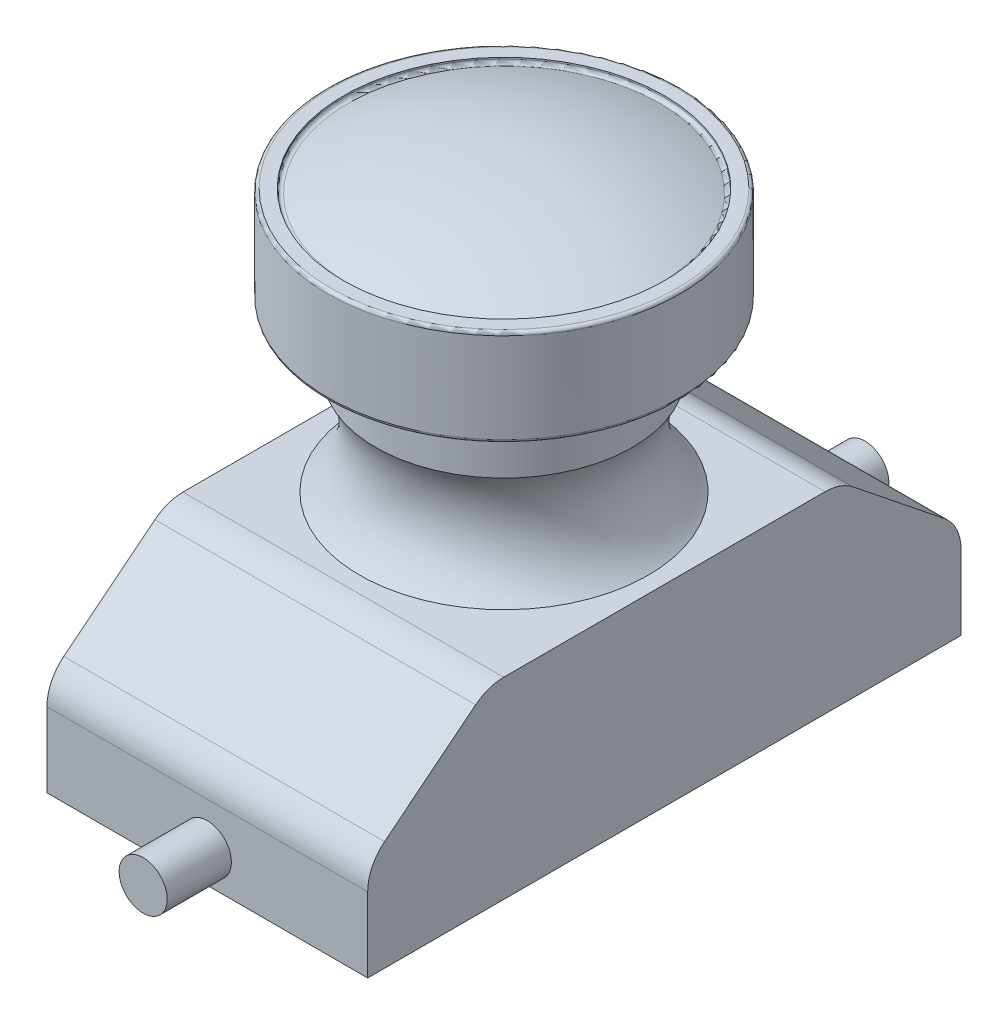
ISO-10303-21;
HEADER;
FILE_DESCRIPTION(('STEP AP214'),'2;1');
FILE_NAME('part.step','',(''),(''),'','','');
FILE_SCHEMA(('AUTOMOTIVE_DESIGN { 1 0 10303 214 1 1 1 1 }'));
ENDSEC;
DATA;
#1=APPLICATION_CONTEXT('core data for automotive mechanical design processes');
#2=APPLICATION_PROTOCOL_DEFINITION('international standard','automotive_design',2000,#1);
#3=PRODUCT_CONTEXT('',#1,'mechanical');
#4=PRODUCT('Part','Part','',(#3));
#5=PRODUCT_RELATED_PRODUCT_CATEGORY('part','',(#4));
#6=PRODUCT_DEFINITION_FORMATION('','',#4);
#7=PRODUCT_DEFINITION_CONTEXT('part definition',#1,'design');
#8=PRODUCT_DEFINITION('design','',#6,#7);
#9=PRODUCT_DEFINITION_SHAPE('','',#8);
#10=(LENGTH_UNIT() NAMED_UNIT(*) SI_UNIT(.MILLI.,.METRE.));
#11=(NAMED_UNIT(*) PLANE_ANGLE_UNIT() SI_UNIT($,.RADIAN.));
#12=(NAMED_UNIT(*) SI_UNIT($,.STERADIAN.) SOLID_ANGLE_UNIT());
#13=UNCERTAINTY_MEASURE_WITH_UNIT(LENGTH_MEASURE(1.E-05),#10,'distance_accuracy_value','');
#14=(GEOMETRIC_REPRESENTATION_CONTEXT(3) GLOBAL_UNCERTAINTY_ASSIGNED_CONTEXT((#13)) GLOBAL_UNIT_ASSIGNED_CONTEXT((#10,
#11,#12)) REPRESENTATION_CONTEXT('',''));
#15=CARTESIAN_POINT('',(0.,0.,0.));
#16=DIRECTION('',(0.,0.,1.));
#17=DIRECTION('',(1.,0.,0.));
#18=AXIS2_PLACEMENT_3D('',#15,#16,#17);
#19=CARTESIAN_POINT('',(5.,0.,9.25));
#20=DIRECTION('',(0.,0.,-1.));
#21=DIRECTION('',(-1.,0.,0.));
#22=AXIS2_PLACEMENT_3D('',#19,#20,#21);
#23=PLANE('',#22);
#24=CARTESIAN_POINT('',(0.,1.,9.25));
#25=DIRECTION('',(0.,0.,-1.));
#26=DIRECTION('',(-1.,0.,0.));
#27=AXIS2_PLACEMENT_3D('',#24,#25,#26);
#28=CIRCLE('',#27,0.75);
#29=CARTESIAN_POINT('',(-0.75,1.,9.25));
#30=VERTEX_POINT('',#29);
#31=EDGE_CURVE('E351',#30,#30,#28,.T.);
#32=ORIENTED_EDGE('',*,*,#31,.T.);
#33=EDGE_LOOP('',(#32));
#34=FACE_BOUND('',#33,.T.);
#35=DIRECTION('',(0.,-1.,0.));
#36=VECTOR('',#35,1.);
#37=CARTESIAN_POINT('',(5.,0.,9.25));
#38=LINE('',#37,#36);
#39=CARTESIAN_POINT('',(5.,2.3271252135188,9.25));
#40=VERTEX_POINT('',#39);
#41=CARTESIAN_POINT('',(5.,0.,9.25));
#42=VERTEX_POINT('',#41);
#43=EDGE_CURVE('E250',#40,#42,#38,.T.);
#44=ORIENTED_EDGE('',*,*,#43,.F.);
#45=DIRECTION('',(-1.,0.,0.));
#46=VECTOR('',#45,1.);
#47=CARTESIAN_POINT('',(5.,2.3271252135188,9.25));
#48=LINE('',#47,#46);
#49=CARTESIAN_POINT('',(-5.,2.3271252135188,9.25));
#50=VERTEX_POINT('',#49);
#51=EDGE_CURVE('E282',#40,#50,#48,.T.);
#52=ORIENTED_EDGE('',*,*,#51,.T.);
#53=DIRECTION('',(0.,-1.,0.));
#54=VECTOR('',#53,1.);
#55=CARTESIAN_POINT('',(-5.,0.,9.25));
#56=LINE('',#55,#54);
#57=CARTESIAN_POINT('',(-5.,0.,9.25));
#58=VERTEX_POINT('',#57);
#59=EDGE_CURVE('E315',#50,#58,#56,.T.);
#60=ORIENTED_EDGE('',*,*,#59,.T.);
#61=DIRECTION('',(-1.,0.,0.));
#62=VECTOR('',#61,1.);
#63=CARTESIAN_POINT('',(5.,0.,9.25));
#64=LINE('',#63,#62);
#65=EDGE_CURVE('E254',#42,#58,#64,.T.);
#66=ORIENTED_EDGE('',*,*,#65,.F.);
#67=EDGE_LOOP('',(#44,#52,#60,#66));
#68=FACE_BOUND('',#67,.T.);
#69=ADVANCED_FACE('F38',(#34,#68),#23,.F.);
#70=CARTESIAN_POINT('',(5.,0.,9.25));
#71=DIRECTION('',(0.,1.,0.));
#72=DIRECTION('',(0.,0.,1.));
#73=AXIS2_PLACEMENT_3D('',#70,#71,#72);
#74=PLANE('',#73);
#75=DIRECTION('',(0.,0.,-1.));
#76=VECTOR('',#75,1.);
#77=CARTESIAN_POINT('',(-5.,0.,9.25));
#78=LINE('',#77,#76);
#79=CARTESIAN_POINT('',(-5.,0.,-9.25));
#80=VERTEX_POINT('',#79);
#81=EDGE_CURVE('E243',#58,#80,#78,.T.);
#82=ORIENTED_EDGE('',*,*,#81,.T.);
#83=DIRECTION('',(-1.,0.,0.));
#84=VECTOR('',#83,1.);
#85=CARTESIAN_POINT('',(5.,0.,-9.25));
#86=LINE('',#85,#84);
#87=CARTESIAN_POINT('',(5.,0.,-9.25));
#88=VERTEX_POINT('',#87);
#89=EDGE_CURVE('E251',#88,#80,#86,.T.);
#90=ORIENTED_EDGE('',*,*,#89,.F.);
#91=DIRECTION('',(0.,0.,-1.));
#92=VECTOR('',#91,1.);
#93=CARTESIAN_POINT('',(5.,0.,9.25));
#94=LINE('',#93,#92);
#95=EDGE_CURVE('E218',#42,#88,#94,.T.);
#96=ORIENTED_EDGE('',*,*,#95,.F.);
#97=ORIENTED_EDGE('',*,*,#65,.T.);
#98=EDGE_LOOP('',(#82,#90,#96,#97));
#99=FACE_BOUND('',#98,.T.);
#100=ADVANCED_FACE('F138',(#99),#74,.F.);
#101=CARTESIAN_POINT('',(5.,3.,-9.25));
#102=DIRECTION('',(0.,0.,1.));
#103=DIRECTION('',(1.,0.,0.));
#104=AXIS2_PLACEMENT_3D('',#101,#102,#103);
#105=PLANE('',#104);
#106=CARTESIAN_POINT('',(0.,1.,-9.25));
#107=DIRECTION('',(0.,0.,1.));
#108=DIRECTION('',(1.,0.,0.));
#109=AXIS2_PLACEMENT_3D('',#106,#107,#108);
#110=CIRCLE('',#109,0.75);
#111=CARTESIAN_POINT('',(0.75,1.,-9.25));
#112=VERTEX_POINT('',#111);
#113=EDGE_CURVE('E11',#112,#112,#110,.F.);
#114=ORIENTED_EDGE('',*,*,#113,.F.);
#115=EDGE_LOOP('',(#114));
#116=FACE_BOUND('',#115,.T.);
#117=DIRECTION('',(0.,1.,0.));
#118=VECTOR('',#117,1.);
#119=CARTESIAN_POINT('',(-5.,3.,-9.25));
#120=LINE('',#119,#118);
#121=CARTESIAN_POINT('',(-5.,2.3271252135188,-9.25));
#122=VERTEX_POINT('',#121);
#123=EDGE_CURVE('E212',#80,#122,#120,.T.);
#124=ORIENTED_EDGE('',*,*,#123,.T.);
#125=DIRECTION('',(-1.,0.,0.));
#126=VECTOR('',#125,1.);
#127=CARTESIAN_POINT('',(5.,2.3271252135188,-9.25));
#128=LINE('',#127,#126);
#129=CARTESIAN_POINT('',(5.,2.3271252135188,-9.25));
#130=VERTEX_POINT('',#129);
#131=EDGE_CURVE('E47',#122,#130,#128,.F.);
#132=ORIENTED_EDGE('',*,*,#131,.T.);
#133=DIRECTION('',(0.,1.,0.));
#134=VECTOR('',#133,1.);
#135=CARTESIAN_POINT('',(5.,3.,-9.25));
#136=LINE('',#135,#134);
#137=EDGE_CURVE('E210',#88,#130,#136,.T.);
#138=ORIENTED_EDGE('',*,*,#137,.F.);
#139=ORIENTED_EDGE('',*,*,#89,.T.);
#140=EDGE_LOOP('',(#124,#132,#138,#139));
#141=FACE_BOUND('',#140,.T.);
#142=ADVANCED_FACE('F144',(#116,#141),#105,.F.);
#143=CARTESIAN_POINT('',(5.,6.,-5.5));
#144=DIRECTION('',(0.,-0.78086880944303,0.624695047554424));
#145=DIRECTION('',(0.,-0.624695047554424,-0.78086880944303));
#146=AXIS2_PLACEMENT_3D('',#143,#144,#145);
#147=PLANE('',#146);
#148=DIRECTION('',(0.,0.624695047554424,0.78086880944303));
#149=VECTOR('',#148,1.);
#150=CARTESIAN_POINT('',(-5.,6.,-5.5));
#151=LINE('',#150,#149);
#152=CARTESIAN_POINT('',(-5.,3.42034154673905,-8.72457306657619));
#153=VERTEX_POINT('',#152);
#154=CARTESIAN_POINT('',(-5.,5.69321633322024,-5.8834795834747));
#155=VERTEX_POINT('',#154);
#156=EDGE_CURVE('E229',#153,#155,#151,.T.);
#157=ORIENTED_EDGE('',*,*,#156,.T.);
#158=DIRECTION('',(-1.,0.,0.));
#159=VECTOR('',#158,1.);
#160=CARTESIAN_POINT('',(5.,5.69321633322024,-5.8834795834747));
#161=LINE('',#160,#159);
#162=CARTESIAN_POINT('',(5.,5.69321633322024,-5.8834795834747));
#163=VERTEX_POINT('',#162);
#164=EDGE_CURVE('E175',#155,#163,#161,.F.);
#165=ORIENTED_EDGE('',*,*,#164,.T.);
#166=DIRECTION('',(0.,0.624695047554424,0.78086880944303));
#167=VECTOR('',#166,1.);
#168=CARTESIAN_POINT('',(5.,6.,-5.5));
#169=LINE('',#168,#167);
#170=CARTESIAN_POINT('',(5.,3.42034154673905,-8.72457306657619));
#171=VERTEX_POINT('',#170);
#172=EDGE_CURVE('E221',#171,#163,#169,.T.);
#173=ORIENTED_EDGE('',*,*,#172,.F.);
#174=DIRECTION('',(-1.,0.,0.));
#175=VECTOR('',#174,1.);
#176=CARTESIAN_POINT('',(5.,3.42034154673905,-8.72457306657619));
#177=LINE('',#176,#175);
#178=EDGE_CURVE('E197',#171,#153,#177,.T.);
#179=ORIENTED_EDGE('',*,*,#178,.T.);
#180=EDGE_LOOP('',(#157,#165,#173,#179));
#181=FACE_BOUND('',#180,.T.);
#182=ADVANCED_FACE('F228',(#181),#147,.F.);
#183=CARTESIAN_POINT('',(5.,6.,5.5));
#184=DIRECTION('',(0.,-1.,0.));
#185=DIRECTION('',(0.,0.,-1.));
#186=AXIS2_PLACEMENT_3D('',#183,#184,#185);
#187=PLANE('',#186);
#188=CARTESIAN_POINT('',(0.,6.,0.));
#189=DIRECTION('',(0.,-1.,0.));
#190=DIRECTION('',(0.,0.,-1.));
#191=AXIS2_PLACEMENT_3D('',#188,#189,#190);
#192=CIRCLE('',#191,4.5);
#193=CARTESIAN_POINT('',(0.,6.,-4.5));
#194=VERTEX_POINT('',#193);
#195=EDGE_CURVE('E318',#194,#194,#192,.T.);
#196=ORIENTED_EDGE('',*,*,#195,.T.);
#197=EDGE_LOOP('',(#196));
#198=FACE_BOUND('',#197,.T.);
#199=DIRECTION('',(0.,0.,1.));
#200=VECTOR('',#199,1.);
#201=CARTESIAN_POINT('',(-5.,6.,5.5));
#202=LINE('',#201,#200);
#203=CARTESIAN_POINT('',(-5.,6.,-5.0089065168985));
#204=VERTEX_POINT('',#203);
#205=CARTESIAN_POINT('',(-5.,6.,5.0089065168985));
#206=VERTEX_POINT('',#205);
#207=EDGE_CURVE('E236',#204,#206,#202,.T.);
#208=ORIENTED_EDGE('',*,*,#207,.T.);
#209=DIRECTION('',(-1.,0.,0.));
#210=VECTOR('',#209,1.);
#211=CARTESIAN_POINT('',(5.,6.,5.0089065168985));
#212=LINE('',#211,#210);
#213=CARTESIAN_POINT('',(5.,6.,5.0089065168985));
#214=VERTEX_POINT('',#213);
#215=EDGE_CURVE('E54',#206,#214,#212,.F.);
#216=ORIENTED_EDGE('',*,*,#215,.T.);
#217=DIRECTION('',(0.,0.,1.));
#218=VECTOR('',#217,1.);
#219=CARTESIAN_POINT('',(5.,6.,5.5));
#220=LINE('',#219,#218);
#221=CARTESIAN_POINT('',(5.,6.,-5.0089065168985));
#222=VERTEX_POINT('',#221);
#223=EDGE_CURVE('E311',#222,#214,#220,.T.);
#224=ORIENTED_EDGE('',*,*,#223,.F.);
#225=DIRECTION('',(-1.,0.,0.));
#226=VECTOR('',#225,1.);
#227=CARTESIAN_POINT('',(5.,6.,-5.0089065168985));
#228=LINE('',#227,#226);
#229=EDGE_CURVE('E177',#222,#204,#228,.T.);
#230=ORIENTED_EDGE('',*,*,#229,.T.);
#231=EDGE_LOOP('',(#208,#216,#224,#230));
#232=FACE_BOUND('',#231,.T.);
#233=ADVANCED_FACE('F385',(#198,#232),#187,.F.);
#234=CARTESIAN_POINT('',(5.,3.,9.25));
#235=DIRECTION('',(0.,-0.78086880944303,-0.624695047554424));
#236=DIRECTION('',(0.,0.624695047554424,-0.78086880944303));
#237=AXIS2_PLACEMENT_3D('',#234,#235,#236);
#238=PLANE('',#237);
#239=DIRECTION('',(0.,-0.624695047554424,0.78086880944303));
#240=VECTOR('',#239,1.);
#241=CARTESIAN_POINT('',(-5.,3.,9.25));
#242=LINE('',#241,#240);
#243=CARTESIAN_POINT('',(-5.,5.69321633322024,5.8834795834747));
#244=VERTEX_POINT('',#243);
#245=CARTESIAN_POINT('',(-5.,3.42034154673905,8.72457306657619));
#246=VERTEX_POINT('',#245);
#247=EDGE_CURVE('E241',#244,#246,#242,.T.);
#248=ORIENTED_EDGE('',*,*,#247,.T.);
#249=DIRECTION('',(-1.,0.,0.));
#250=VECTOR('',#249,1.);
#251=CARTESIAN_POINT('',(5.,3.42034154673905,8.72457306657619));
#252=LINE('',#251,#250);
#253=CARTESIAN_POINT('',(5.,3.42034154673905,8.72457306657619));
#254=VERTEX_POINT('',#253);
#255=EDGE_CURVE('E187',#246,#254,#252,.F.);
#256=ORIENTED_EDGE('',*,*,#255,.T.);
#257=DIRECTION('',(0.,-0.624695047554424,0.78086880944303));
#258=VECTOR('',#257,1.);
#259=CARTESIAN_POINT('',(5.,3.,9.25));
#260=LINE('',#259,#258);
#261=CARTESIAN_POINT('',(5.,5.69321633322024,5.8834795834747));
#262=VERTEX_POINT('',#261);
#263=EDGE_CURVE('E255',#262,#254,#260,.T.);
#264=ORIENTED_EDGE('',*,*,#263,.F.);
#265=DIRECTION('',(-1.,0.,0.));
#266=VECTOR('',#265,1.);
#267=CARTESIAN_POINT('',(5.,5.69321633322024,5.8834795834747));
#268=LINE('',#267,#266);
#269=EDGE_CURVE('E296',#262,#244,#268,.T.);
#270=ORIENTED_EDGE('',*,*,#269,.T.);
#271=EDGE_LOOP('',(#248,#256,#264,#270));
#272=FACE_BOUND('',#271,.T.);
#273=ADVANCED_FACE('F304',(#272),#238,.F.);
#274=CARTESIAN_POINT('',(5.,0.,0.));
#275=DIRECTION('',(-1.,0.,0.));
#276=DIRECTION('',(0.,0.,1.));
#277=AXIS2_PLACEMENT_3D('',#274,#275,#276);
#278=PLANE('',#277);
#279=ORIENTED_EDGE('',*,*,#263,.T.);
#280=CARTESIAN_POINT('',(5.,2.3271252135188,7.85));
#281=DIRECTION('',(-1.,0.,0.));
#282=DIRECTION('',(0.,0.,1.));
#283=AXIS2_PLACEMENT_3D('',#280,#281,#282);
#284=CIRCLE('',#283,1.4);
#285=EDGE_CURVE('E185',#254,#40,#284,.F.);
#286=ORIENTED_EDGE('',*,*,#285,.T.);
#287=ORIENTED_EDGE('',*,*,#43,.T.);
#288=ORIENTED_EDGE('',*,*,#95,.T.);
#289=ORIENTED_EDGE('',*,*,#137,.T.);
#290=CARTESIAN_POINT('',(5.,2.3271252135188,-7.85));
#291=DIRECTION('',(-1.,0.,0.));
#292=DIRECTION('',(0.,0.,1.));
#293=AXIS2_PLACEMENT_3D('',#290,#291,#292);
#294=CIRCLE('',#293,1.4);
#295=EDGE_CURVE('E180',#130,#171,#294,.F.);
#296=ORIENTED_EDGE('',*,*,#295,.T.);
#297=ORIENTED_EDGE('',*,*,#172,.T.);
#298=CARTESIAN_POINT('',(5.,4.6,-5.0089065168985));
#299=DIRECTION('',(-1.,0.,0.));
#300=DIRECTION('',(0.,0.,1.));
#301=AXIS2_PLACEMENT_3D('',#298,#299,#300);
#302=CIRCLE('',#301,1.4);
#303=EDGE_CURVE('E61',#163,#222,#302,.F.);
#304=ORIENTED_EDGE('',*,*,#303,.T.);
#305=ORIENTED_EDGE('',*,*,#223,.T.);
#306=CARTESIAN_POINT('',(5.,4.6,5.0089065168985));
#307=DIRECTION('',(-1.,0.,0.));
#308=DIRECTION('',(0.,0.,1.));
#309=AXIS2_PLACEMENT_3D('',#306,#307,#308);
#310=CIRCLE('',#309,1.4);
#311=EDGE_CURVE('E179',#214,#262,#310,.F.);
#312=ORIENTED_EDGE('',*,*,#311,.T.);
#313=EDGE_LOOP('',(#279,#286,#287,#288,#289,#296,#297,#304,#305,#312));
#314=FACE_BOUND('',#313,.T.);
#315=ADVANCED_FACE('F215',(#314),#278,.F.);
#316=CARTESIAN_POINT('',(-5.,0.,0.));
#317=DIRECTION('',(-1.,0.,0.));
#318=DIRECTION('',(0.,0.,1.));
#319=AXIS2_PLACEMENT_3D('',#316,#317,#318);
#320=PLANE('',#319);
#321=ORIENTED_EDGE('',*,*,#59,.F.);
#322=CARTESIAN_POINT('',(-5.,2.3271252135188,7.85));
#323=DIRECTION('',(-1.,0.,0.));
#324=DIRECTION('',(0.,0.,1.));
#325=AXIS2_PLACEMENT_3D('',#322,#323,#324);
#326=CIRCLE('',#325,1.4);
#327=EDGE_CURVE('E293',#50,#246,#326,.T.);
#328=ORIENTED_EDGE('',*,*,#327,.T.);
#329=ORIENTED_EDGE('',*,*,#247,.F.);
#330=CARTESIAN_POINT('',(-5.,4.6,5.0089065168985));
#331=DIRECTION('',(-1.,0.,0.));
#332=DIRECTION('',(0.,0.,1.));
#333=AXIS2_PLACEMENT_3D('',#330,#331,#332);
#334=CIRCLE('',#333,1.4);
#335=EDGE_CURVE('E290',#244,#206,#334,.T.);
#336=ORIENTED_EDGE('',*,*,#335,.T.);
#337=ORIENTED_EDGE('',*,*,#207,.F.);
#338=CARTESIAN_POINT('',(-5.,4.6,-5.0089065168985));
#339=DIRECTION('',(-1.,0.,0.));
#340=DIRECTION('',(0.,0.,1.));
#341=AXIS2_PLACEMENT_3D('',#338,#339,#340);
#342=CIRCLE('',#341,1.4);
#343=EDGE_CURVE('E234',#204,#155,#342,.T.);
#344=ORIENTED_EDGE('',*,*,#343,.T.);
#345=ORIENTED_EDGE('',*,*,#156,.F.);
#346=CARTESIAN_POINT('',(-5.,2.3271252135188,-7.85));
#347=DIRECTION('',(-1.,0.,0.));
#348=DIRECTION('',(0.,0.,1.));
#349=AXIS2_PLACEMENT_3D('',#346,#347,#348);
#350=CIRCLE('',#349,1.4);
#351=EDGE_CURVE('E224',#153,#122,#350,.T.);
#352=ORIENTED_EDGE('',*,*,#351,.T.);
#353=ORIENTED_EDGE('',*,*,#123,.F.);
#354=ORIENTED_EDGE('',*,*,#81,.F.);
#355=EDGE_LOOP('',(#321,#328,#329,#336,#337,#344,#345,#352,#353,#354));
#356=FACE_BOUND('',#355,.T.);
#357=ADVANCED_FACE('F232',(#356),#320,.T.);
#358=CARTESIAN_POINT('',(0.,7.89402615915736,0.));
#359=DIRECTION('',(0.,-1.,0.));
#360=DIRECTION('',(0.,0.,-1.));
#361=AXIS2_PLACEMENT_3D('',#358,#359,#360);
#362=TOROIDAL_SURFACE('',#361,6.13176741860708,2.5);
#363=CARTESIAN_POINT('',(0.,9.20000000000001,0.));
#364=DIRECTION('',(0.,-1.,0.));
#365=DIRECTION('',(0.,0.,-1.));
#366=AXIS2_PLACEMENT_3D('',#363,#364,#365);
#367=CIRCLE('',#366,4.);
#368=CARTESIAN_POINT('',(0.,9.20000000000001,-4.));
#369=VERTEX_POINT('',#368);
#370=EDGE_CURVE('E324',#369,#369,#367,.T.);
#371=ORIENTED_EDGE('',*,*,#370,.T.);
#372=EDGE_LOOP('',(#371));
#373=FACE_BOUND('',#372,.T.);
#374=ORIENTED_EDGE('',*,*,#195,.F.);
#375=EDGE_LOOP('',(#374));
#376=FACE_BOUND('',#375,.T.);
#377=ADVANCED_FACE('F395',(#373,#376),#362,.F.);
#378=CARTESIAN_POINT('',(0.,6.,0.));
#379=DIRECTION('',(0.,-1.,0.));
#380=DIRECTION('',(0.,0.,-1.));
#381=AXIS2_PLACEMENT_3D('',#378,#379,#380);
#382=CYLINDRICAL_SURFACE('',#381,4.);
#383=CARTESIAN_POINT('',(0.,11.2,0.));
#384=DIRECTION('',(0.,-1.,0.));
#385=DIRECTION('',(0.,0.,-1.));
#386=AXIS2_PLACEMENT_3D('',#383,#384,#385);
#387=CIRCLE('',#386,4.);
#388=CARTESIAN_POINT('',(0.,11.2,-4.));
#389=VERTEX_POINT('',#388);
#390=EDGE_CURVE('E338',#389,#389,#387,.T.);
#391=ORIENTED_EDGE('',*,*,#390,.T.);
#392=EDGE_LOOP('',(#391));
#393=FACE_BOUND('',#392,.T.);
#394=ORIENTED_EDGE('',*,*,#370,.F.);
#395=EDGE_LOOP('',(#394));
#396=FACE_BOUND('',#395,.T.);
#397=ADVANCED_FACE('F400',(#393,#396),#382,.T.);
#398=CARTESIAN_POINT('',(0.,11.2,-5.5));
#399=DIRECTION('',(0.,-1.,0.));
#400=DIRECTION('',(0.,0.,-1.));
#401=AXIS2_PLACEMENT_3D('',#398,#399,#400);
#402=PLANE('',#401);
#403=CARTESIAN_POINT('',(0.,11.2,0.));
#404=DIRECTION('',(0.,-1.,0.));
#405=DIRECTION('',(0.,0.,-1.));
#406=AXIS2_PLACEMENT_3D('',#403,#404,#405);
#407=CIRCLE('',#406,5.4);
#408=CARTESIAN_POINT('',(0.,11.2,-5.4));
#409=VERTEX_POINT('',#408);
#410=EDGE_CURVE('E259',#409,#409,#407,.T.);
#411=ORIENTED_EDGE('',*,*,#410,.T.);
#412=EDGE_LOOP('',(#411));
#413=FACE_BOUND('',#412,.T.);
#414=ORIENTED_EDGE('',*,*,#390,.F.);
#415=EDGE_LOOP('',(#414));
#416=FACE_BOUND('',#415,.T.);
#417=ADVANCED_FACE('F404',(#413,#416),#402,.T.);
#418=CARTESIAN_POINT('',(0.,6.,0.));
#419=DIRECTION('',(0.,-1.,0.));
#420=DIRECTION('',(0.,0.,-1.));
#421=AXIS2_PLACEMENT_3D('',#418,#419,#420);
#422=CYLINDRICAL_SURFACE('',#421,5.5);
#423=CARTESIAN_POINT('',(0.,11.3,0.));
#424=DIRECTION('',(0.,-1.,0.));
#425=DIRECTION('',(0.,0.,-1.));
#426=AXIS2_PLACEMENT_3D('',#423,#424,#425);
#427=CIRCLE('',#426,5.5);
#428=CARTESIAN_POINT('',(0.,11.3,-5.5));
#429=VERTEX_POINT('',#428);
#430=EDGE_CURVE('E267',#429,#429,#427,.F.);
#431=ORIENTED_EDGE('',*,*,#430,.T.);
#432=EDGE_LOOP('',(#431));
#433=FACE_BOUND('',#432,.T.);
#434=CARTESIAN_POINT('',(0.,14.1,0.));
#435=DIRECTION('',(0.,1.,0.));
#436=DIRECTION('',(0.,0.,1.));
#437=AXIS2_PLACEMENT_3D('',#434,#435,#436);
#438=CIRCLE('',#437,5.5);
#439=CARTESIAN_POINT('',(0.,14.1,5.5));
#440=VERTEX_POINT('',#439);
#441=EDGE_CURVE('E263',#440,#440,#438,.F.);
#442=ORIENTED_EDGE('',*,*,#441,.T.);
#443=EDGE_LOOP('',(#442));
#444=FACE_BOUND('',#443,.T.);
#445=ADVANCED_FACE('F408',(#433,#444),#422,.T.);
#446=CARTESIAN_POINT('',(0.,14.2,-5.));
#447=DIRECTION('',(0.,1.,0.));
#448=DIRECTION('',(0.,0.,1.));
#449=AXIS2_PLACEMENT_3D('',#446,#447,#448);
#450=PLANE('',#449);
#451=CARTESIAN_POINT('',(0.,14.2,0.));
#452=DIRECTION('',(0.,1.,0.));
#453=DIRECTION('',(0.,0.,1.));
#454=AXIS2_PLACEMENT_3D('',#451,#452,#453);
#455=CIRCLE('',#454,5.4);
#456=CARTESIAN_POINT('',(0.,14.2,5.4));
#457=VERTEX_POINT('',#456);
#458=EDGE_CURVE('E271',#457,#457,#455,.T.);
#459=ORIENTED_EDGE('',*,*,#458,.T.);
#460=EDGE_LOOP('',(#459));
#461=FACE_BOUND('',#460,.T.);
#462=CARTESIAN_POINT('',(0.,14.2,0.));
#463=DIRECTION('',(0.,-1.,0.));
#464=DIRECTION('',(0.,0.,-1.));
#465=AXIS2_PLACEMENT_3D('',#462,#463,#464);
#466=CIRCLE('',#465,5.);
#467=CARTESIAN_POINT('',(0.,14.2,-5.));
#468=VERTEX_POINT('',#467);
#469=EDGE_CURVE('E342',#468,#468,#466,.T.);
#470=ORIENTED_EDGE('',*,*,#469,.T.);
#471=EDGE_LOOP('',(#470));
#472=FACE_BOUND('',#471,.T.);
#473=ADVANCED_FACE('F132',(#461,#472),#450,.T.);
#474=CARTESIAN_POINT('',(0.,6.,0.));
#475=DIRECTION('',(0.,-1.,0.));
#476=DIRECTION('',(0.,0.,-1.));
#477=AXIS2_PLACEMENT_3D('',#474,#475,#476);
#478=CYLINDRICAL_SURFACE('',#477,5.);
#479=CARTESIAN_POINT('',(0.,14.151701238125,0.));
#480=DIRECTION('',(0.,-1.,0.));
#481=DIRECTION('',(0.,0.,-1.));
#482=AXIS2_PLACEMENT_3D('',#479,#480,#481);
#483=CIRCLE('',#482,5.);
#484=CARTESIAN_POINT('',(0.,14.151701238125,-5.));
#485=VERTEX_POINT('',#484);
#486=EDGE_CURVE('E275',#485,#485,#483,.T.);
#487=ORIENTED_EDGE('',*,*,#486,.T.);
#488=EDGE_LOOP('',(#487));
#489=FACE_BOUND('',#488,.T.);
#490=ORIENTED_EDGE('',*,*,#469,.F.);
#491=EDGE_LOOP('',(#490));
#492=FACE_BOUND('',#491,.T.);
#493=ADVANCED_FACE('F122',(#489,#492),#478,.F.);
#494=CARTESIAN_POINT('',(0.,3.00167236240251,-0.200334472480498));
#495=DIRECTION('',(-1.,0.,0.));
#496=DIRECTION('',(0.,0.,-1.));
#497=AXIS2_PLACEMENT_3D('',#494,#495,#496);
#498=CIRCLE('',#497,12.);
#499=TRIMMED_CURVE('',#498,(PARAMETER_VALUE(-1.58749164174817)),
(PARAMETER_VALUE(1.58749164174817)),.T.,.PARAMETER.);
#500=CARTESIAN_POINT('',(0.,3.00167236240251,0.));
#501=DIRECTION('',(0.,-1.,0.));
#502=AXIS1_PLACEMENT('',#500,#501);
#503=SURFACE_OF_REVOLUTION('',#499,#502);
#504=CARTESIAN_POINT('',(0.,14.0595522391521,0.));
#505=DIRECTION('',(0.,-1.,0.));
#506=DIRECTION('',(0.,0.,-1.));
#507=AXIS2_PLACEMENT_3D('',#504,#505,#506);
#508=CIRCLE('',#507,4.86115978902877);
#509=CARTESIAN_POINT('',(0.,14.0595522391521,-4.86115978902877));
#510=VERTEX_POINT('',#509);
#511=EDGE_CURVE('E279',#510,#510,#508,.F.);
#512=ORIENTED_EDGE('',*,*,#511,.T.);
#513=EDGE_LOOP('',(#512));
#514=FACE_BOUND('',#513,.T.);
#515=CARTESIAN_POINT('',(0.,15.,0.));
#516=VERTEX_POINT('',#515);
#517=VERTEX_LOOP('',#516);
#518=FACE_BOUND('',#517,.T.);
#519=ADVANCED_FACE('F119',(#514,#518),#503,.T.);
#520=CARTESIAN_POINT('',(0.,11.3,0.));
#521=DIRECTION('',(0.,-1.,0.));
#522=DIRECTION('',(0.,0.,-1.));
#523=AXIS2_PLACEMENT_3D('',#520,#521,#522);
#524=TOROIDAL_SURFACE('',#523,5.4,0.1);
#525=ORIENTED_EDGE('',*,*,#430,.F.);
#526=EDGE_LOOP('',(#525));
#527=FACE_BOUND('',#526,.T.);
#528=ORIENTED_EDGE('',*,*,#410,.F.);
#529=EDGE_LOOP('',(#528));
#530=FACE_BOUND('',#529,.T.);
#531=ADVANCED_FACE('F121',(#527,#530),#524,.T.);
#532=CARTESIAN_POINT('',(0.,14.1,0.));
#533=DIRECTION('',(0.,1.,0.));
#534=DIRECTION('',(0.,0.,1.));
#535=AXIS2_PLACEMENT_3D('',#532,#533,#534);
#536=TOROIDAL_SURFACE('',#535,5.4,0.1);
#537=ORIENTED_EDGE('',*,*,#458,.F.);
#538=EDGE_LOOP('',(#537));
#539=FACE_BOUND('',#538,.T.);
#540=ORIENTED_EDGE('',*,*,#441,.F.);
#541=EDGE_LOOP('',(#540));
#542=FACE_BOUND('',#541,.T.);
#543=ADVANCED_FACE('F129',(#539,#542),#536,.T.);
#544=CARTESIAN_POINT('',(0.,14.151701238125,0.));
#545=DIRECTION('',(0.,-1.,0.));
#546=DIRECTION('',(0.,0.,-1.));
#547=AXIS2_PLACEMENT_3D('',#544,#545,#546);
#548=TOROIDAL_SURFACE('',#547,4.9,0.1);
#549=ORIENTED_EDGE('',*,*,#511,.F.);
#550=EDGE_LOOP('',(#549));
#551=FACE_BOUND('',#550,.T.);
#552=ORIENTED_EDGE('',*,*,#486,.F.);
#553=EDGE_LOOP('',(#552));
#554=FACE_BOUND('',#553,.T.);
#555=ADVANCED_FACE('F153',(#551,#554),#548,.F.);
#556=CARTESIAN_POINT('',(5.,2.3271252135188,7.85));
#557=DIRECTION('',(-1.,0.,0.));
#558=DIRECTION('',(0.,0.,1.));
#559=AXIS2_PLACEMENT_3D('',#556,#557,#558);
#560=CYLINDRICAL_SURFACE('',#559,1.4);
#561=ORIENTED_EDGE('',*,*,#285,.F.);
#562=ORIENTED_EDGE('',*,*,#255,.F.);
#563=ORIENTED_EDGE('',*,*,#327,.F.);
#564=ORIENTED_EDGE('',*,*,#51,.F.);
#565=EDGE_LOOP('',(#561,#562,#563,#564));
#566=FACE_BOUND('',#565,.T.);
#567=ADVANCED_FACE('F157',(#566),#560,.T.);
#568=CARTESIAN_POINT('',(5.,4.6,5.0089065168985));
#569=DIRECTION('',(-1.,0.,0.));
#570=DIRECTION('',(0.,0.,1.));
#571=AXIS2_PLACEMENT_3D('',#568,#569,#570);
#572=CYLINDRICAL_SURFACE('',#571,1.4);
#573=ORIENTED_EDGE('',*,*,#311,.F.);
#574=ORIENTED_EDGE('',*,*,#215,.F.);
#575=ORIENTED_EDGE('',*,*,#335,.F.);
#576=ORIENTED_EDGE('',*,*,#269,.F.);
#577=EDGE_LOOP('',(#573,#574,#575,#576));
#578=FACE_BOUND('',#577,.T.);
#579=ADVANCED_FACE('F161',(#578),#572,.T.);
#580=CARTESIAN_POINT('',(5.,4.6,-5.0089065168985));
#581=DIRECTION('',(-1.,0.,0.));
#582=DIRECTION('',(0.,0.,1.));
#583=AXIS2_PLACEMENT_3D('',#580,#581,#582);
#584=CYLINDRICAL_SURFACE('',#583,1.4);
#585=ORIENTED_EDGE('',*,*,#303,.F.);
#586=ORIENTED_EDGE('',*,*,#164,.F.);
#587=ORIENTED_EDGE('',*,*,#343,.F.);
#588=ORIENTED_EDGE('',*,*,#229,.F.);
#589=EDGE_LOOP('',(#585,#586,#587,#588));
#590=FACE_BOUND('',#589,.T.);
#591=ADVANCED_FACE('F164',(#590),#584,.T.);
#592=CARTESIAN_POINT('',(5.,2.3271252135188,-7.85));
#593=DIRECTION('',(-1.,0.,0.));
#594=DIRECTION('',(0.,0.,1.));
#595=AXIS2_PLACEMENT_3D('',#592,#593,#594);
#596=CYLINDRICAL_SURFACE('',#595,1.4);
#597=ORIENTED_EDGE('',*,*,#295,.F.);
#598=ORIENTED_EDGE('',*,*,#131,.F.);
#599=ORIENTED_EDGE('',*,*,#351,.F.);
#600=ORIENTED_EDGE('',*,*,#178,.F.);
#601=EDGE_LOOP('',(#597,#598,#599,#600));
#602=FACE_BOUND('',#601,.T.);
#603=ADVANCED_FACE('F40',(#602),#596,.T.);
#604=CARTESIAN_POINT('',(0.,1.,-11.25));
#605=DIRECTION('',(0.,0.,1.));
#606=DIRECTION('',(1.,0.,0.));
#607=AXIS2_PLACEMENT_3D('',#604,#605,#606);
#608=CYLINDRICAL_SURFACE('',#607,0.75);
#609=CARTESIAN_POINT('',(0.,1.,-11.25));
#610=DIRECTION('',(0.,0.,-1.));
#611=DIRECTION('',(-1.,0.,0.));
#612=AXIS2_PLACEMENT_3D('',#609,#610,#611);
#613=CIRCLE('',#612,0.75);
#614=CARTESIAN_POINT('',(-0.75,1.,-11.25));
#615=VERTEX_POINT('',#614);
#616=EDGE_CURVE('E346',#615,#615,#613,.T.);
#617=ORIENTED_EDGE('',*,*,#616,.F.);
#618=EDGE_LOOP('',(#617));
#619=FACE_BOUND('',#618,.T.);
#620=ORIENTED_EDGE('',*,*,#113,.T.);
#621=EDGE_LOOP('',(#620));
#622=FACE_BOUND('',#621,.T.);
#623=ADVANCED_FACE('F171',(#619,#622),#608,.T.);
#624=CARTESIAN_POINT('',(0.,1.,-11.25));
#625=DIRECTION('',(0.,0.,-1.));
#626=DIRECTION('',(-1.,0.,0.));
#627=AXIS2_PLACEMENT_3D('',#624,#625,#626);
#628=PLANE('',#627);
#629=ORIENTED_EDGE('',*,*,#616,.T.);
#630=EDGE_LOOP('',(#629));
#631=FACE_BOUND('',#630,.T.);
#632=ADVANCED_FACE('F368',(#631),#628,.T.);
#633=CARTESIAN_POINT('',(0.,1.,11.25));
#634=DIRECTION('',(0.,0.,-1.));
#635=DIRECTION('',(-1.,0.,0.));
#636=AXIS2_PLACEMENT_3D('',#633,#634,#635);
#637=CYLINDRICAL_SURFACE('',#636,0.75);
#638=CARTESIAN_POINT('',(0.,1.,11.25));
#639=DIRECTION('',(0.,0.,-1.));
#640=DIRECTION('',(-1.,0.,0.));
#641=AXIS2_PLACEMENT_3D('',#638,#639,#640);
#642=CIRCLE('',#641,0.75);
#643=CARTESIAN_POINT('',(-0.75,1.,11.25));
#644=VERTEX_POINT('',#643);
#645=EDGE_CURVE('E350',#644,#644,#642,.T.);
#646=ORIENTED_EDGE('',*,*,#645,.T.);
#647=EDGE_LOOP('',(#646));
#648=FACE_BOUND('',#647,.T.);
#649=ORIENTED_EDGE('',*,*,#31,.F.);
#650=EDGE_LOOP('',(#649));
#651=FACE_BOUND('',#650,.T.);
#652=ADVANCED_FACE('F359',(#648,#651),#637,.T.);
#653=CARTESIAN_POINT('',(0.,1.,11.25));
#654=DIRECTION('',(0.,0.,1.));
#655=DIRECTION('',(-1.,0.,0.));
#656=AXIS2_PLACEMENT_3D('',#653,#654,#655);
#657=PLANE('',#656);
#658=ORIENTED_EDGE('',*,*,#645,.F.);
#659=EDGE_LOOP('',(#658));
#660=FACE_BOUND('',#659,.T.);
#661=ADVANCED_FACE('F362',(#660),#657,.T.);
#662=CLOSED_SHELL('',(#69,#100,#142,#182,#233,#273,#315,#357,#377,#397,#417,#445,#473,#493,#519,
#531,#543,#555,#567,#579,#591,#603,#623,#632,#652,#661));
#663=MANIFOLD_SOLID_BREP('B2',#662);
#664=ADVANCED_BREP_SHAPE_REPRESENTATION('',(#18,#663),#14);
#665=SHAPE_DEFINITION_REPRESENTATION(#9,#664);
ENDSEC;
END-ISO-10303-21;
